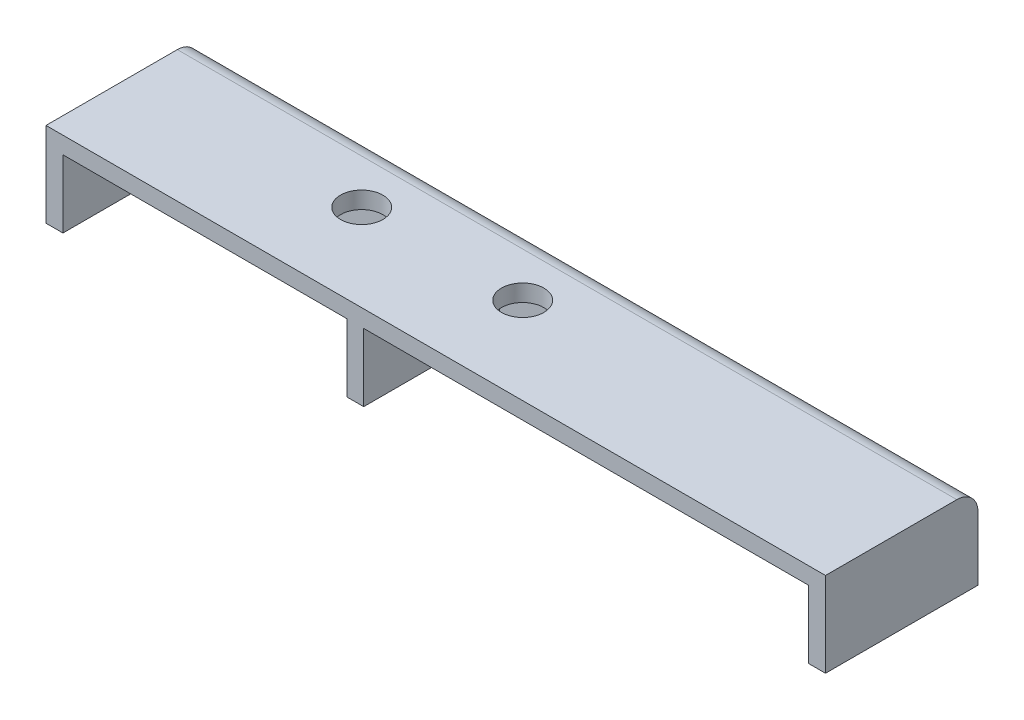
ISO-10303-21;
HEADER;
FILE_DESCRIPTION(('STEP AP214'),'2;1');
FILE_NAME('part.step','',(''),(''),'','','');
FILE_SCHEMA(('AUTOMOTIVE_DESIGN { 1 0 10303 214 1 1 1 1 }'));
ENDSEC;
DATA;
#1=APPLICATION_CONTEXT('core data for automotive mechanical design processes');
#2=APPLICATION_PROTOCOL_DEFINITION('international standard','automotive_design',2000,#1);
#3=PRODUCT_CONTEXT('',#1,'mechanical');
#4=PRODUCT('Part','Part','',(#3));
#5=PRODUCT_RELATED_PRODUCT_CATEGORY('part','',(#4));
#6=PRODUCT_DEFINITION_FORMATION('','',#4);
#7=PRODUCT_DEFINITION_CONTEXT('part definition',#1,'design');
#8=PRODUCT_DEFINITION('design','',#6,#7);
#9=PRODUCT_DEFINITION_SHAPE('','',#8);
#10=(LENGTH_UNIT() NAMED_UNIT(*) SI_UNIT(.MILLI.,.METRE.));
#11=(NAMED_UNIT(*) PLANE_ANGLE_UNIT() SI_UNIT($,.RADIAN.));
#12=(NAMED_UNIT(*) SI_UNIT($,.STERADIAN.) SOLID_ANGLE_UNIT());
#13=UNCERTAINTY_MEASURE_WITH_UNIT(LENGTH_MEASURE(1.E-05),#10,'distance_accuracy_value','');
#14=(GEOMETRIC_REPRESENTATION_CONTEXT(3) GLOBAL_UNCERTAINTY_ASSIGNED_CONTEXT((#13)) GLOBAL_UNIT_ASSIGNED_CONTEXT((#10,
#11,#12)) REPRESENTATION_CONTEXT('',''));
#15=CARTESIAN_POINT('',(0.,0.,0.));
#16=DIRECTION('',(0.,0.,1.));
#17=DIRECTION('',(1.,0.,0.));
#18=AXIS2_PLACEMENT_3D('',#15,#16,#17);
#19=CARTESIAN_POINT('',(0.,-2.,0.));
#20=DIRECTION('',(0.,-1.,0.));
#21=DIRECTION('',(0.,0.,-1.));
#22=AXIS2_PLACEMENT_3D('',#19,#20,#21);
#23=PLANE('',#22);
#24=CARTESIAN_POINT('',(-19.,-2.,-10.26));
#25=DIRECTION('',(0.,-1.,0.));
#26=DIRECTION('',(0.,0.,-1.));
#27=AXIS2_PLACEMENT_3D('',#24,#25,#26);
#28=CIRCLE('',#27,2.5);
#29=CARTESIAN_POINT('',(-19.,-2.,-12.76));
#30=VERTEX_POINT('',#29);
#31=EDGE_CURVE('E221',#30,#30,#28,.F.);
#32=ORIENTED_EDGE('',*,*,#31,.T.);
#33=EDGE_LOOP('',(#32));
#34=FACE_BOUND('',#33,.T.);
#35=DIRECTION('',(1.,0.,0.));
#36=VECTOR('',#35,1.);
#37=CARTESIAN_POINT('',(46.,-2.,-15.4999999999999));
#38=LINE('',#37,#36);
#39=CARTESIAN_POINT('',(-10.5,-2.,-15.5));
#40=VERTEX_POINT('',#39);
#41=CARTESIAN_POINT('',(-44.,-2.,-15.5));
#42=VERTEX_POINT('',#41);
#43=EDGE_CURVE('E217',#40,#42,#38,.F.);
#44=ORIENTED_EDGE('',*,*,#43,.F.);
#45=DIRECTION('',(0.,0.,-1.));
#46=VECTOR('',#45,1.);
#47=CARTESIAN_POINT('',(-10.5,-2.,0.));
#48=LINE('',#47,#46);
#49=CARTESIAN_POINT('',(-10.5,-2.,0.));
#50=VERTEX_POINT('',#49);
#51=EDGE_CURVE('E283',#50,#40,#48,.T.);
#52=ORIENTED_EDGE('',*,*,#51,.F.);
#53=DIRECTION('',(1.,0.,0.));
#54=VECTOR('',#53,1.);
#55=CARTESIAN_POINT('',(-46.,-2.,0.));
#56=LINE('',#55,#54);
#57=CARTESIAN_POINT('',(-44.,-2.,0.));
#58=VERTEX_POINT('',#57);
#59=EDGE_CURVE('E235',#58,#50,#56,.T.);
#60=ORIENTED_EDGE('',*,*,#59,.F.);
#61=DIRECTION('',(0.,0.,-1.));
#62=VECTOR('',#61,1.);
#63=CARTESIAN_POINT('',(-44.,-2.,0.));
#64=LINE('',#63,#62);
#65=EDGE_CURVE('E296',#58,#42,#64,.T.);
#66=ORIENTED_EDGE('',*,*,#65,.T.);
#67=EDGE_LOOP('',(#44,#52,#60,#66));
#68=FACE_BOUND('',#67,.T.);
#69=ADVANCED_FACE('F58',(#34,#68),#23,.T.);
#70=CARTESIAN_POINT('',(46.,-2.5,-15.4999999999999));
#71=DIRECTION('',(1.,0.,0.));
#72=DIRECTION('',(0.,0.,-1.));
#73=AXIS2_PLACEMENT_3D('',#70,#71,#72);
#74=CYLINDRICAL_SURFACE('',#73,0.500000000000004);
#75=CARTESIAN_POINT('',(-10.5,-2.5,-15.5));
#76=DIRECTION('',(1.,0.,0.));
#77=DIRECTION('',(0.,0.,-1.));
#78=AXIS2_PLACEMENT_3D('',#75,#76,#77);
#79=CIRCLE('',#78,0.5);
#80=CARTESIAN_POINT('',(-10.5,-2.50000000000001,-16.));
#81=VERTEX_POINT('',#80);
#82=EDGE_CURVE('E285',#81,#40,#79,.T.);
#83=ORIENTED_EDGE('',*,*,#82,.T.);
#84=ORIENTED_EDGE('',*,*,#43,.T.);
#85=CARTESIAN_POINT('',(-44.,-2.5,-15.5));
#86=DIRECTION('',(1.,0.,0.));
#87=DIRECTION('',(0.,0.,-1.));
#88=AXIS2_PLACEMENT_3D('',#85,#86,#87);
#89=CIRCLE('',#88,0.5);
#90=CARTESIAN_POINT('',(-44.,-2.50000000000001,-16.));
#91=VERTEX_POINT('',#90);
#92=EDGE_CURVE('E299',#91,#42,#89,.T.);
#93=ORIENTED_EDGE('',*,*,#92,.F.);
#94=DIRECTION('',(1.,0.,0.));
#95=VECTOR('',#94,1.);
#96=CARTESIAN_POINT('',(-46.,-2.5,-16.));
#97=LINE('',#96,#95);
#98=EDGE_CURVE('E195',#91,#81,#97,.T.);
#99=ORIENTED_EDGE('',*,*,#98,.T.);
#100=EDGE_LOOP('',(#83,#84,#93,#99));
#101=FACE_BOUND('',#100,.T.);
#102=ADVANCED_FACE('F352',(#101),#74,.F.);
#103=CARTESIAN_POINT('',(0.,0.,-15.9999999999999));
#104=DIRECTION('',(0.,0.,1.));
#105=DIRECTION('',(0.,-1.,0.));
#106=AXIS2_PLACEMENT_3D('',#103,#104,#105);
#107=PLANE('',#106);
#108=DIRECTION('',(1.,0.,0.));
#109=VECTOR('',#108,1.);
#110=CARTESIAN_POINT('',(-46.,-10.,-16.));
#111=LINE('',#110,#109);
#112=CARTESIAN_POINT('',(-10.5,-10.,-16.));
#113=VERTEX_POINT('',#112);
#114=CARTESIAN_POINT('',(-44.,-10.,-16.));
#115=VERTEX_POINT('',#114);
#116=EDGE_CURVE('E319',#113,#115,#111,.F.);
#117=ORIENTED_EDGE('',*,*,#116,.F.);
#118=DIRECTION('',(0.,1.,0.));
#119=VECTOR('',#118,1.);
#120=CARTESIAN_POINT('',(-10.5,-10.,-16.));
#121=LINE('',#120,#119);
#122=EDGE_CURVE('E272',#113,#81,#121,.T.);
#123=ORIENTED_EDGE('',*,*,#122,.T.);
#124=ORIENTED_EDGE('',*,*,#98,.F.);
#125=DIRECTION('',(0.,1.,0.));
#126=VECTOR('',#125,1.);
#127=CARTESIAN_POINT('',(-44.,-10.,-16.));
#128=LINE('',#127,#126);
#129=EDGE_CURVE('E302',#115,#91,#128,.T.);
#130=ORIENTED_EDGE('',*,*,#129,.F.);
#131=EDGE_LOOP('',(#117,#123,#124,#130));
#132=FACE_BOUND('',#131,.T.);
#133=ADVANCED_FACE('F350',(#132),#107,.T.);
#134=CARTESIAN_POINT('',(46.,-2.,-17.9999999999999));
#135=DIRECTION('',(1.,0.,0.));
#136=DIRECTION('',(0.,0.,-1.));
#137=AXIS2_PLACEMENT_3D('',#134,#135,#136);
#138=PLANE('',#137);
#139=DIRECTION('',(0.,0.,-1.));
#140=VECTOR('',#139,1.);
#141=CARTESIAN_POINT('',(46.,0.,-17.9999999999999));
#142=LINE('',#141,#140);
#143=CARTESIAN_POINT('',(46.,0.,0.));
#144=VERTEX_POINT('',#143);
#145=CARTESIAN_POINT('',(46.,0.,-15.4999999999999));
#146=VERTEX_POINT('',#145);
#147=EDGE_CURVE('E243',#144,#146,#142,.T.);
#148=ORIENTED_EDGE('',*,*,#147,.F.);
#149=DIRECTION('',(0.,1.,0.));
#150=VECTOR('',#149,1.);
#151=CARTESIAN_POINT('',(46.,-2.,0.));
#152=LINE('',#151,#150);
#153=CARTESIAN_POINT('',(46.,-10.,0.));
#154=VERTEX_POINT('',#153);
#155=EDGE_CURVE('E13',#154,#144,#152,.T.);
#156=ORIENTED_EDGE('',*,*,#155,.F.);
#157=DIRECTION('',(0.,0.,1.));
#158=VECTOR('',#157,1.);
#159=CARTESIAN_POINT('',(46.,-9.99999999999999,-18.));
#160=LINE('',#159,#158);
#161=CARTESIAN_POINT('',(46.,-9.99999999999999,-18.));
#162=VERTEX_POINT('',#161);
#163=EDGE_CURVE('E306',#162,#154,#160,.T.);
#164=ORIENTED_EDGE('',*,*,#163,.F.);
#165=DIRECTION('',(0.,-1.,0.));
#166=VECTOR('',#165,1.);
#167=CARTESIAN_POINT('',(46.,0.,-17.9999999999999));
#168=LINE('',#167,#166);
#169=CARTESIAN_POINT('',(46.,-2.49999999999998,-17.9999999999999));
#170=VERTEX_POINT('',#169);
#171=EDGE_CURVE('E317',#170,#162,#168,.T.);
#172=ORIENTED_EDGE('',*,*,#171,.F.);
#173=CARTESIAN_POINT('',(46.,-2.5,-15.4999999999999));
#174=DIRECTION('',(1.,0.,0.));
#175=DIRECTION('',(0.,0.,-1.));
#176=AXIS2_PLACEMENT_3D('',#173,#174,#175);
#177=CIRCLE('',#176,2.5);
#178=EDGE_CURVE('E209',#170,#146,#177,.T.);
#179=ORIENTED_EDGE('',*,*,#178,.T.);
#180=EDGE_LOOP('',(#148,#156,#164,#172,#179));
#181=FACE_BOUND('',#180,.T.);
#182=ADVANCED_FACE('F326',(#181),#138,.T.);
#183=DIRECTION('',(0.,0.,-1.));
#184=VECTOR('',#183,1.);
#185=CARTESIAN_POINT('',(44.,-2.,0.));
#186=LINE('',#185,#184);
#187=CARTESIAN_POINT('',(44.,-2.,0.));
#188=VERTEX_POINT('',#187);
#189=CARTESIAN_POINT('',(44.,-2.,-15.5));
#190=VERTEX_POINT('',#189);
#191=EDGE_CURVE('E177',#188,#190,#186,.T.);
#192=ORIENTED_EDGE('',*,*,#191,.F.);
#193=CARTESIAN_POINT('',(-8.49999999999999,-2.,0.));
#194=VERTEX_POINT('',#193);
#195=EDGE_CURVE('E238',#194,#188,#56,.T.);
#196=ORIENTED_EDGE('',*,*,#195,.F.);
#197=DIRECTION('',(0.,0.,-1.));
#198=VECTOR('',#197,1.);
#199=CARTESIAN_POINT('',(-8.49999999999999,-2.,0.));
#200=LINE('',#199,#198);
#201=CARTESIAN_POINT('',(-8.49999999999999,-2.,-15.5));
#202=VERTEX_POINT('',#201);
#203=EDGE_CURVE('E263',#194,#202,#200,.T.);
#204=ORIENTED_EDGE('',*,*,#203,.T.);
#205=EDGE_CURVE('E215',#190,#202,#38,.F.);
#206=ORIENTED_EDGE('',*,*,#205,.F.);
#207=EDGE_LOOP('',(#192,#196,#204,#206));
#208=FACE_BOUND('',#207,.T.);
#209=CARTESIAN_POINT('',(0.,-2.,-10.26));
#210=DIRECTION('',(0.,-1.,0.));
#211=DIRECTION('',(0.,0.,-1.));
#212=AXIS2_PLACEMENT_3D('',#209,#210,#211);
#213=CIRCLE('',#212,2.5);
#214=CARTESIAN_POINT('',(0.,-2.,-12.76));
#215=VERTEX_POINT('',#214);
#216=EDGE_CURVE('E227',#215,#215,#213,.F.);
#217=ORIENTED_EDGE('',*,*,#216,.T.);
#218=EDGE_LOOP('',(#217));
#219=FACE_BOUND('',#218,.T.);
#220=ADVANCED_FACE('F261',(#208,#219),#23,.T.);
#221=CARTESIAN_POINT('',(0.,0.,0.));
#222=DIRECTION('',(0.,-1.,0.));
#223=DIRECTION('',(0.,0.,-1.));
#224=AXIS2_PLACEMENT_3D('',#221,#222,#223);
#225=PLANE('',#224);
#226=CARTESIAN_POINT('',(-19.,0.,-10.26));
#227=DIRECTION('',(0.,1.,0.));
#228=DIRECTION('',(0.,0.,1.));
#229=AXIS2_PLACEMENT_3D('',#226,#227,#228);
#230=CIRCLE('',#229,2.5);
#231=CARTESIAN_POINT('',(-19.,0.,-7.75999999999997));
#232=VERTEX_POINT('',#231);
#233=EDGE_CURVE('E230',#232,#232,#230,.T.);
#234=ORIENTED_EDGE('',*,*,#233,.F.);
#235=EDGE_LOOP('',(#234));
#236=FACE_BOUND('',#235,.T.);
#237=CARTESIAN_POINT('',(0.,0.,-10.26));
#238=DIRECTION('',(0.,1.,0.));
#239=DIRECTION('',(0.,0.,1.));
#240=AXIS2_PLACEMENT_3D('',#237,#238,#239);
#241=CIRCLE('',#240,2.5);
#242=CARTESIAN_POINT('',(0.,0.,-7.75999999999997));
#243=VERTEX_POINT('',#242);
#244=EDGE_CURVE('E223',#243,#243,#241,.T.);
#245=ORIENTED_EDGE('',*,*,#244,.F.);
#246=EDGE_LOOP('',(#245));
#247=FACE_BOUND('',#246,.T.);
#248=DIRECTION('',(1.,0.,0.));
#249=VECTOR('',#248,1.);
#250=CARTESIAN_POINT('',(46.,0.,-15.4999999999999));
#251=LINE('',#250,#249);
#252=CARTESIAN_POINT('',(-46.,0.,-15.4999999999999));
#253=VERTEX_POINT('',#252);
#254=EDGE_CURVE('E206',#146,#253,#251,.F.);
#255=ORIENTED_EDGE('',*,*,#254,.T.);
#256=DIRECTION('',(0.,0.,1.));
#257=VECTOR('',#256,1.);
#258=CARTESIAN_POINT('',(-46.,0.,-18.));
#259=LINE('',#258,#257);
#260=CARTESIAN_POINT('',(-46.,0.,0.));
#261=VERTEX_POINT('',#260);
#262=EDGE_CURVE('E226',#253,#261,#259,.T.);
#263=ORIENTED_EDGE('',*,*,#262,.T.);
#264=DIRECTION('',(1.,0.,0.));
#265=VECTOR('',#264,1.);
#266=CARTESIAN_POINT('',(-46.,0.,0.));
#267=LINE('',#266,#265);
#268=EDGE_CURVE('E240',#261,#144,#267,.T.);
#269=ORIENTED_EDGE('',*,*,#268,.T.);
#270=ORIENTED_EDGE('',*,*,#147,.T.);
#271=EDGE_LOOP('',(#255,#263,#269,#270));
#272=FACE_BOUND('',#271,.T.);
#273=ADVANCED_FACE('F336',(#236,#247,#272),#225,.F.);
#274=CARTESIAN_POINT('',(-46.,-2.,0.));
#275=DIRECTION('',(0.,0.,1.));
#276=DIRECTION('',(1.,0.,0.));
#277=AXIS2_PLACEMENT_3D('',#274,#275,#276);
#278=PLANE('',#277);
#279=ORIENTED_EDGE('',*,*,#268,.F.);
#280=DIRECTION('',(0.,1.,0.));
#281=VECTOR('',#280,1.);
#282=CARTESIAN_POINT('',(-46.,-2.,0.));
#283=LINE('',#282,#281);
#284=CARTESIAN_POINT('',(-46.,-10.,0.));
#285=VERTEX_POINT('',#284);
#286=EDGE_CURVE('E62',#285,#261,#283,.T.);
#287=ORIENTED_EDGE('',*,*,#286,.F.);
#288=DIRECTION('',(-1.,0.,0.));
#289=VECTOR('',#288,1.);
#290=CARTESIAN_POINT('',(-44.,-10.,0.));
#291=LINE('',#290,#289);
#292=CARTESIAN_POINT('',(-44.,-10.,0.));
#293=VERTEX_POINT('',#292);
#294=EDGE_CURVE('E201',#293,#285,#291,.T.);
#295=ORIENTED_EDGE('',*,*,#294,.F.);
#296=DIRECTION('',(0.,-1.,0.));
#297=VECTOR('',#296,1.);
#298=CARTESIAN_POINT('',(-44.,-2.,0.));
#299=LINE('',#298,#297);
#300=EDGE_CURVE('E294',#58,#293,#299,.T.);
#301=ORIENTED_EDGE('',*,*,#300,.F.);
#302=ORIENTED_EDGE('',*,*,#59,.T.);
#303=DIRECTION('',(0.,-1.,0.));
#304=VECTOR('',#303,1.);
#305=CARTESIAN_POINT('',(-10.5,-2.,0.));
#306=LINE('',#305,#304);
#307=CARTESIAN_POINT('',(-10.5,-10.,0.));
#308=VERTEX_POINT('',#307);
#309=EDGE_CURVE('E280',#50,#308,#306,.T.);
#310=ORIENTED_EDGE('',*,*,#309,.T.);
#311=DIRECTION('',(-1.,0.,0.));
#312=VECTOR('',#311,1.);
#313=CARTESIAN_POINT('',(-8.49999999999999,-10.,0.));
#314=LINE('',#313,#312);
#315=CARTESIAN_POINT('',(-8.49999999999999,-10.,0.));
#316=VERTEX_POINT('',#315);
#317=EDGE_CURVE('E278',#316,#308,#314,.T.);
#318=ORIENTED_EDGE('',*,*,#317,.F.);
#319=DIRECTION('',(0.,-1.,0.));
#320=VECTOR('',#319,1.);
#321=CARTESIAN_POINT('',(-8.49999999999999,-2.,0.));
#322=LINE('',#321,#320);
#323=EDGE_CURVE('E257',#194,#316,#322,.T.);
#324=ORIENTED_EDGE('',*,*,#323,.F.);
#325=ORIENTED_EDGE('',*,*,#195,.T.);
#326=DIRECTION('',(0.,-1.,0.));
#327=VECTOR('',#326,1.);
#328=CARTESIAN_POINT('',(44.,-2.,0.));
#329=LINE('',#328,#327);
#330=CARTESIAN_POINT('',(44.,-10.,0.));
#331=VERTEX_POINT('',#330);
#332=EDGE_CURVE('E255',#188,#331,#329,.T.);
#333=ORIENTED_EDGE('',*,*,#332,.T.);
#334=DIRECTION('',(1.,0.,0.));
#335=VECTOR('',#334,1.);
#336=CARTESIAN_POINT('',(44.,-10.,0.));
#337=LINE('',#336,#335);
#338=EDGE_CURVE('E265',#331,#154,#337,.T.);
#339=ORIENTED_EDGE('',*,*,#338,.T.);
#340=ORIENTED_EDGE('',*,*,#155,.T.);
#341=EDGE_LOOP('',(#279,#287,#295,#301,#302,#310,#318,#324,#325,#333,#339,#340));
#342=FACE_BOUND('',#341,.T.);
#343=ADVANCED_FACE('F253',(#342),#278,.T.);
#344=CARTESIAN_POINT('',(-46.,-2.,-18.));
#345=DIRECTION('',(-1.,0.,0.));
#346=DIRECTION('',(0.,0.,1.));
#347=AXIS2_PLACEMENT_3D('',#344,#345,#346);
#348=PLANE('',#347);
#349=DIRECTION('',(0.,1.,0.));
#350=VECTOR('',#349,1.);
#351=CARTESIAN_POINT('',(-46.,0.,-17.9999999999999));
#352=LINE('',#351,#350);
#353=CARTESIAN_POINT('',(-46.,-9.99999999999999,-18.));
#354=VERTEX_POINT('',#353);
#355=CARTESIAN_POINT('',(-46.,-2.49999999999999,-18.));
#356=VERTEX_POINT('',#355);
#357=EDGE_CURVE('E312',#354,#356,#352,.T.);
#358=ORIENTED_EDGE('',*,*,#357,.F.);
#359=DIRECTION('',(0.,0.,1.));
#360=VECTOR('',#359,1.);
#361=CARTESIAN_POINT('',(-46.,-9.99999999999999,-18.));
#362=LINE('',#361,#360);
#363=EDGE_CURVE('E309',#354,#285,#362,.T.);
#364=ORIENTED_EDGE('',*,*,#363,.T.);
#365=ORIENTED_EDGE('',*,*,#286,.T.);
#366=ORIENTED_EDGE('',*,*,#262,.F.);
#367=CARTESIAN_POINT('',(-46.,-2.5,-15.4999999999999));
#368=DIRECTION('',(1.,0.,0.));
#369=DIRECTION('',(0.,0.,-1.));
#370=AXIS2_PLACEMENT_3D('',#367,#368,#369);
#371=CIRCLE('',#370,2.5);
#372=EDGE_CURVE('E208',#253,#356,#371,.F.);
#373=ORIENTED_EDGE('',*,*,#372,.T.);
#374=EDGE_LOOP('',(#358,#364,#365,#366,#373));
#375=FACE_BOUND('',#374,.T.);
#376=ADVANCED_FACE('F60',(#375),#348,.T.);
#377=CARTESIAN_POINT('',(-19.,-2.001,-10.26));
#378=DIRECTION('',(0.,1.,0.));
#379=DIRECTION('',(0.,0.,1.));
#380=AXIS2_PLACEMENT_3D('',#377,#378,#379);
#381=CYLINDRICAL_SURFACE('',#380,2.5);
#382=ORIENTED_EDGE('',*,*,#31,.F.);
#383=EDGE_LOOP('',(#382));
#384=FACE_BOUND('',#383,.T.);
#385=ORIENTED_EDGE('',*,*,#233,.T.);
#386=EDGE_LOOP('',(#385));
#387=FACE_BOUND('',#386,.T.);
#388=ADVANCED_FACE('F394',(#384,#387),#381,.F.);
#389=CARTESIAN_POINT('',(0.,-2.001,-10.26));
#390=DIRECTION('',(0.,1.,0.));
#391=DIRECTION('',(0.,0.,1.));
#392=AXIS2_PLACEMENT_3D('',#389,#390,#391);
#393=CYLINDRICAL_SURFACE('',#392,2.5);
#394=ORIENTED_EDGE('',*,*,#216,.F.);
#395=EDGE_LOOP('',(#394));
#396=FACE_BOUND('',#395,.T.);
#397=ORIENTED_EDGE('',*,*,#244,.T.);
#398=EDGE_LOOP('',(#397));
#399=FACE_BOUND('',#398,.T.);
#400=ADVANCED_FACE('F398',(#396,#399),#393,.F.);
#401=CARTESIAN_POINT('',(46.,-2.5,-15.4999999999999));
#402=DIRECTION('',(1.,0.,0.));
#403=DIRECTION('',(0.,0.,-1.));
#404=AXIS2_PLACEMENT_3D('',#401,#402,#403);
#405=CYLINDRICAL_SURFACE('',#404,2.5);
#406=ORIENTED_EDGE('',*,*,#254,.F.);
#407=ORIENTED_EDGE('',*,*,#178,.F.);
#408=DIRECTION('',(1.,0.,0.));
#409=VECTOR('',#408,1.);
#410=CARTESIAN_POINT('',(-46.,-2.49999999999998,-18.));
#411=LINE('',#410,#409);
#412=EDGE_CURVE('E320',#170,#356,#411,.F.);
#413=ORIENTED_EDGE('',*,*,#412,.T.);
#414=ORIENTED_EDGE('',*,*,#372,.F.);
#415=EDGE_LOOP('',(#406,#407,#413,#414));
#416=FACE_BOUND('',#415,.T.);
#417=ADVANCED_FACE('F403',(#416),#405,.T.);
#418=CARTESIAN_POINT('',(-8.49999999999999,-2.50000000000001,-16.));
#419=VERTEX_POINT('',#418);
#420=CARTESIAN_POINT('',(44.,-2.50000000000001,-16.));
#421=VERTEX_POINT('',#420);
#422=EDGE_CURVE('E187',#419,#421,#97,.T.);
#423=ORIENTED_EDGE('',*,*,#422,.T.);
#424=CARTESIAN_POINT('',(44.,-2.5,-15.5));
#425=DIRECTION('',(1.,0.,0.));
#426=DIRECTION('',(0.,0.,-1.));
#427=AXIS2_PLACEMENT_3D('',#424,#425,#426);
#428=CIRCLE('',#427,0.5);
#429=EDGE_CURVE('E174',#421,#190,#428,.T.);
#430=ORIENTED_EDGE('',*,*,#429,.T.);
#431=ORIENTED_EDGE('',*,*,#205,.T.);
#432=CARTESIAN_POINT('',(-8.49999999999999,-2.5,-15.5));
#433=DIRECTION('',(1.,0.,0.));
#434=DIRECTION('',(0.,0.,-1.));
#435=AXIS2_PLACEMENT_3D('',#432,#433,#434);
#436=CIRCLE('',#435,0.5);
#437=EDGE_CURVE('E194',#419,#202,#436,.T.);
#438=ORIENTED_EDGE('',*,*,#437,.F.);
#439=EDGE_LOOP('',(#423,#430,#431,#438));
#440=FACE_BOUND('',#439,.T.);
#441=ADVANCED_FACE('F192',(#440),#74,.F.);
#442=CARTESIAN_POINT('',(0.,0.,-17.9999999999999));
#443=DIRECTION('',(0.,0.,1.));
#444=DIRECTION('',(0.,-1.,0.));
#445=AXIS2_PLACEMENT_3D('',#442,#443,#444);
#446=PLANE('',#445);
#447=ORIENTED_EDGE('',*,*,#412,.F.);
#448=ORIENTED_EDGE('',*,*,#171,.T.);
#449=DIRECTION('',(-1.,0.,0.));
#450=VECTOR('',#449,1.);
#451=CARTESIAN_POINT('',(0.,-9.99999999999999,-18.));
#452=LINE('',#451,#450);
#453=EDGE_CURVE('E315',#162,#354,#452,.T.);
#454=ORIENTED_EDGE('',*,*,#453,.T.);
#455=ORIENTED_EDGE('',*,*,#357,.T.);
#456=EDGE_LOOP('',(#447,#448,#454,#455));
#457=FACE_BOUND('',#456,.T.);
#458=ADVANCED_FACE('F329',(#457),#446,.F.);
#459=DIRECTION('',(0.,1.,0.));
#460=VECTOR('',#459,1.);
#461=CARTESIAN_POINT('',(44.,-10.,-16.));
#462=LINE('',#461,#460);
#463=CARTESIAN_POINT('',(44.,-10.,-16.));
#464=VERTEX_POINT('',#463);
#465=EDGE_CURVE('E73',#464,#421,#462,.T.);
#466=ORIENTED_EDGE('',*,*,#465,.T.);
#467=ORIENTED_EDGE('',*,*,#422,.F.);
#468=DIRECTION('',(0.,1.,0.));
#469=VECTOR('',#468,1.);
#470=CARTESIAN_POINT('',(-8.49999999999999,-10.,-16.));
#471=LINE('',#470,#469);
#472=CARTESIAN_POINT('',(-8.49999999999999,-10.,-16.));
#473=VERTEX_POINT('',#472);
#474=EDGE_CURVE('E276',#473,#419,#471,.T.);
#475=ORIENTED_EDGE('',*,*,#474,.F.);
#476=EDGE_CURVE('E188',#464,#473,#111,.F.);
#477=ORIENTED_EDGE('',*,*,#476,.F.);
#478=EDGE_LOOP('',(#466,#467,#475,#477));
#479=FACE_BOUND('',#478,.T.);
#480=ADVANCED_FACE('F185',(#479),#107,.T.);
#481=CARTESIAN_POINT('',(-46.,-9.99999999999999,-18.));
#482=DIRECTION('',(0.,1.,0.));
#483=DIRECTION('',(0.,0.,1.));
#484=AXIS2_PLACEMENT_3D('',#481,#482,#483);
#485=PLANE('',#484);
#486=ORIENTED_EDGE('',*,*,#163,.T.);
#487=ORIENTED_EDGE('',*,*,#338,.F.);
#488=DIRECTION('',(0.,0.,1.));
#489=VECTOR('',#488,1.);
#490=CARTESIAN_POINT('',(44.,-10.,-16.));
#491=LINE('',#490,#489);
#492=EDGE_CURVE('E189',#464,#331,#491,.T.);
#493=ORIENTED_EDGE('',*,*,#492,.F.);
#494=ORIENTED_EDGE('',*,*,#476,.T.);
#495=DIRECTION('',(0.,0.,1.));
#496=VECTOR('',#495,1.);
#497=CARTESIAN_POINT('',(-8.49999999999999,-10.,-16.));
#498=LINE('',#497,#496);
#499=EDGE_CURVE('E269',#473,#316,#498,.T.);
#500=ORIENTED_EDGE('',*,*,#499,.T.);
#501=ORIENTED_EDGE('',*,*,#317,.T.);
#502=DIRECTION('',(0.,0.,1.));
#503=VECTOR('',#502,1.);
#504=CARTESIAN_POINT('',(-10.5,-10.,-16.));
#505=LINE('',#504,#503);
#506=EDGE_CURVE('E81',#113,#308,#505,.T.);
#507=ORIENTED_EDGE('',*,*,#506,.F.);
#508=ORIENTED_EDGE('',*,*,#116,.T.);
#509=DIRECTION('',(0.,0.,1.));
#510=VECTOR('',#509,1.);
#511=CARTESIAN_POINT('',(-44.,-10.,-16.));
#512=LINE('',#511,#510);
#513=EDGE_CURVE('E291',#115,#293,#512,.T.);
#514=ORIENTED_EDGE('',*,*,#513,.T.);
#515=ORIENTED_EDGE('',*,*,#294,.T.);
#516=ORIENTED_EDGE('',*,*,#363,.F.);
#517=ORIENTED_EDGE('',*,*,#453,.F.);
#518=EDGE_LOOP('',(#486,#487,#493,#494,#500,#501,#507,#508,#514,#515,#516,#517));
#519=FACE_BOUND('',#518,.T.);
#520=ADVANCED_FACE('F334',(#519),#485,.F.);
#521=CARTESIAN_POINT('',(-44.,-2.5,-15.5));
#522=DIRECTION('',(1.,0.,0.));
#523=DIRECTION('',(0.,0.,-1.));
#524=AXIS2_PLACEMENT_3D('',#521,#522,#523);
#525=PLANE('',#524);
#526=ORIENTED_EDGE('',*,*,#513,.F.);
#527=ORIENTED_EDGE('',*,*,#129,.T.);
#528=ORIENTED_EDGE('',*,*,#92,.T.);
#529=ORIENTED_EDGE('',*,*,#65,.F.);
#530=ORIENTED_EDGE('',*,*,#300,.T.);
#531=EDGE_LOOP('',(#526,#527,#528,#529,#530));
#532=FACE_BOUND('',#531,.T.);
#533=ADVANCED_FACE('F346',(#532),#525,.T.);
#534=CARTESIAN_POINT('',(-8.49999999999999,-2.5,-15.5));
#535=DIRECTION('',(1.,0.,0.));
#536=DIRECTION('',(0.,0.,-1.));
#537=AXIS2_PLACEMENT_3D('',#534,#535,#536);
#538=PLANE('',#537);
#539=ORIENTED_EDGE('',*,*,#499,.F.);
#540=ORIENTED_EDGE('',*,*,#474,.T.);
#541=ORIENTED_EDGE('',*,*,#437,.T.);
#542=ORIENTED_EDGE('',*,*,#203,.F.);
#543=ORIENTED_EDGE('',*,*,#323,.T.);
#544=EDGE_LOOP('',(#539,#540,#541,#542,#543));
#545=FACE_BOUND('',#544,.T.);
#546=ADVANCED_FACE('F360',(#545),#538,.T.);
#547=CARTESIAN_POINT('',(-10.5,-2.5,-15.5));
#548=DIRECTION('',(1.,0.,0.));
#549=DIRECTION('',(0.,0.,-1.));
#550=AXIS2_PLACEMENT_3D('',#547,#548,#549);
#551=PLANE('',#550);
#552=ORIENTED_EDGE('',*,*,#506,.T.);
#553=ORIENTED_EDGE('',*,*,#309,.F.);
#554=ORIENTED_EDGE('',*,*,#51,.T.);
#555=ORIENTED_EDGE('',*,*,#82,.F.);
#556=ORIENTED_EDGE('',*,*,#122,.F.);
#557=EDGE_LOOP('',(#552,#553,#554,#555,#556));
#558=FACE_BOUND('',#557,.T.);
#559=ADVANCED_FACE('F358',(#558),#551,.F.);
#560=CARTESIAN_POINT('',(44.,-2.5,-15.5));
#561=DIRECTION('',(-1.,0.,0.));
#562=DIRECTION('',(0.,0.,-1.));
#563=AXIS2_PLACEMENT_3D('',#560,#561,#562);
#564=PLANE('',#563);
#565=ORIENTED_EDGE('',*,*,#492,.T.);
#566=ORIENTED_EDGE('',*,*,#332,.F.);
#567=ORIENTED_EDGE('',*,*,#191,.T.);
#568=ORIENTED_EDGE('',*,*,#429,.F.);
#569=ORIENTED_EDGE('',*,*,#465,.F.);
#570=EDGE_LOOP('',(#565,#566,#567,#568,#569));
#571=FACE_BOUND('',#570,.T.);
#572=ADVANCED_FACE('F175',(#571),#564,.T.);
#573=CLOSED_SHELL('',(#69,#102,#133,#182,#220,#273,#343,#376,#388,#400,#417,#441,#458,#480,#520,
#533,#546,#559,#572));
#574=MANIFOLD_SOLID_BREP('B2',#573);
#575=ADVANCED_BREP_SHAPE_REPRESENTATION('',(#18,#574),#14);
#576=SHAPE_DEFINITION_REPRESENTATION(#9,#575);
ENDSEC;
END-ISO-10303-21;
